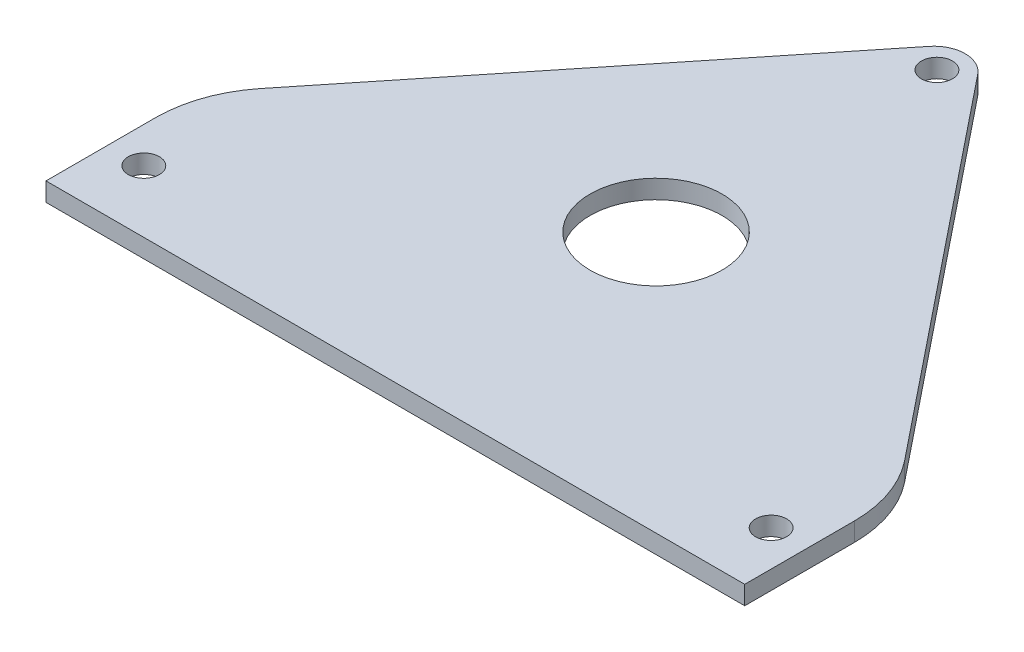
ISO-10303-21;
HEADER;
FILE_DESCRIPTION(('STEP AP214'),'2;1');
FILE_NAME('part.step','',(''),(''),'','','');
FILE_SCHEMA(('AUTOMOTIVE_DESIGN { 1 0 10303 214 1 1 1 1 }'));
ENDSEC;
DATA;
#1=APPLICATION_CONTEXT('core data for automotive mechanical design processes');
#2=APPLICATION_PROTOCOL_DEFINITION('international standard','automotive_design',2000,#1);
#3=PRODUCT_CONTEXT('',#1,'mechanical');
#4=PRODUCT('Part','Part','',(#3));
#5=PRODUCT_RELATED_PRODUCT_CATEGORY('part','',(#4));
#6=PRODUCT_DEFINITION_FORMATION('','',#4);
#7=PRODUCT_DEFINITION_CONTEXT('part definition',#1,'design');
#8=PRODUCT_DEFINITION('design','',#6,#7);
#9=PRODUCT_DEFINITION_SHAPE('','',#8);
#10=(LENGTH_UNIT() NAMED_UNIT(*) SI_UNIT(.MILLI.,.METRE.));
#11=(NAMED_UNIT(*) PLANE_ANGLE_UNIT() SI_UNIT($,.RADIAN.));
#12=(NAMED_UNIT(*) SI_UNIT($,.STERADIAN.) SOLID_ANGLE_UNIT());
#13=UNCERTAINTY_MEASURE_WITH_UNIT(LENGTH_MEASURE(1.E-05),#10,'distance_accuracy_value','');
#14=(GEOMETRIC_REPRESENTATION_CONTEXT(3) GLOBAL_UNCERTAINTY_ASSIGNED_CONTEXT((#13)) GLOBAL_UNIT_ASSIGNED_CONTEXT((#10,
#11,#12)) REPRESENTATION_CONTEXT('',''));
#15=CARTESIAN_POINT('',(0.,0.,0.));
#16=DIRECTION('',(0.,0.,1.));
#17=DIRECTION('',(1.,0.,0.));
#18=AXIS2_PLACEMENT_3D('',#15,#16,#17);
#19=CARTESIAN_POINT('',(0.,1.2,0.));
#20=DIRECTION('',(0.,-1.,0.));
#21=DIRECTION('',(0.,0.,-1.));
#22=AXIS2_PLACEMENT_3D('',#19,#20,#21);
#23=PLANE('',#22);
#24=CARTESIAN_POINT('',(22.5,1.2,-35.14));
#25=DIRECTION('',(0.,1.,0.));
#26=DIRECTION('',(0.,0.,1.));
#27=AXIS2_PLACEMENT_3D('',#24,#25,#26);
#28=CIRCLE('',#27,1.);
#29=CARTESIAN_POINT('',(22.5,1.2,-34.14));
#30=VERTEX_POINT('',#29);
#31=EDGE_CURVE('E204',#30,#30,#28,.T.);
#32=ORIENTED_EDGE('',*,*,#31,.F.);
#33=EDGE_LOOP('',(#32));
#34=FACE_BOUND('',#33,.T.);
#35=CARTESIAN_POINT('',(22.5,1.2,-17.05));
#36=DIRECTION('',(0.,1.,0.));
#37=DIRECTION('',(0.,0.,1.));
#38=AXIS2_PLACEMENT_3D('',#35,#36,#37);
#39=CIRCLE('',#38,4.25);
#40=CARTESIAN_POINT('',(22.5,1.2,-12.8));
#41=VERTEX_POINT('',#40);
#42=EDGE_CURVE('E202',#41,#41,#39,.T.);
#43=ORIENTED_EDGE('',*,*,#42,.F.);
#44=EDGE_LOOP('',(#43));
#45=FACE_BOUND('',#44,.T.);
#46=CARTESIAN_POINT('',(2.3,1.2,-4.26));
#47=DIRECTION('',(0.,1.,0.));
#48=DIRECTION('',(0.,0.,1.));
#49=AXIS2_PLACEMENT_3D('',#46,#47,#48);
#50=CIRCLE('',#49,1.);
#51=CARTESIAN_POINT('',(2.3,1.2,-3.26));
#52=VERTEX_POINT('',#51);
#53=EDGE_CURVE('E187',#52,#52,#50,.T.);
#54=ORIENTED_EDGE('',*,*,#53,.F.);
#55=EDGE_LOOP('',(#54));
#56=FACE_BOUND('',#55,.T.);
#57=CARTESIAN_POINT('',(42.7,1.2,-4.26));
#58=DIRECTION('',(0.,1.,0.));
#59=DIRECTION('',(0.,0.,-1.));
#60=AXIS2_PLACEMENT_3D('',#57,#58,#59);
#61=CIRCLE('',#60,1.);
#62=CARTESIAN_POINT('',(42.7,1.2,-5.26));
#63=VERTEX_POINT('',#62);
#64=EDGE_CURVE('E195',#63,#63,#61,.T.);
#65=ORIENTED_EDGE('',*,*,#64,.F.);
#66=EDGE_LOOP('',(#65));
#67=FACE_BOUND('',#66,.T.);
#68=DIRECTION('',(-1.,0.,0.));
#69=VECTOR('',#68,1.);
#70=CARTESIAN_POINT('',(0.,1.2,-0.26));
#71=LINE('',#70,#69);
#72=CARTESIAN_POINT('',(45.,1.2,-0.26));
#73=VERTEX_POINT('',#72);
#74=CARTESIAN_POINT('',(0.,1.2,-0.26));
#75=VERTEX_POINT('',#74);
#76=EDGE_CURVE('E102',#73,#75,#71,.T.);
#77=ORIENTED_EDGE('',*,*,#76,.F.);
#78=DIRECTION('',(0.,0.,-1.));
#79=VECTOR('',#78,1.);
#80=CARTESIAN_POINT('',(45.,1.2,0.));
#81=LINE('',#80,#79);
#82=CARTESIAN_POINT('',(45.,1.2,-7.31581784542609));
#83=VERTEX_POINT('',#82);
#84=EDGE_CURVE('E132',#73,#83,#81,.T.);
#85=ORIENTED_EDGE('',*,*,#84,.T.);
#86=CARTESIAN_POINT('',(37.,1.2,-7.31581784542609));
#87=DIRECTION('',(0.,-1.,0.));
#88=DIRECTION('',(0.,0.,-1.));
#89=AXIS2_PLACEMENT_3D('',#86,#87,#88);
#90=CIRCLE('',#89,8.);
#91=CARTESIAN_POINT('',(43.2377926461262,1.2,-12.3248040606132));
#92=VERTEX_POINT('',#91);
#93=EDGE_CURVE('E136',#83,#92,#90,.F.);
#94=ORIENTED_EDGE('',*,*,#93,.T.);
#95=DIRECTION('',(0.626123276898389,0.,0.779724080765768));
#96=VECTOR('',#95,1.);
#97=CARTESIAN_POINT('',(22.5,1.2,-38.15));
#98=LINE('',#97,#96);
#99=CARTESIAN_POINT('',(24.0594481615315,1.2,-36.2079874137959));
#100=VERTEX_POINT('',#99);
#101=EDGE_CURVE('E126',#100,#92,#98,.T.);
#102=ORIENTED_EDGE('',*,*,#101,.F.);
#103=CARTESIAN_POINT('',(22.5,1.2,-34.9557408599991));
#104=DIRECTION('',(0.,-1.,0.));
#105=DIRECTION('',(0.,0.,-1.));
#106=AXIS2_PLACEMENT_3D('',#103,#104,#105);
#107=CIRCLE('',#106,2.);
#108=CARTESIAN_POINT('',(20.9405518384685,1.2,-36.2079874137959));
#109=VERTEX_POINT('',#108);
#110=EDGE_CURVE('E160',#100,#109,#107,.F.);
#111=ORIENTED_EDGE('',*,*,#110,.T.);
#112=DIRECTION('',(0.626123276898389,0.,-0.779724080765768));
#113=VECTOR('',#112,1.);
#114=CARTESIAN_POINT('',(0.,1.2,-10.1302913187703));
#115=LINE('',#114,#113);
#116=CARTESIAN_POINT('',(1.76220735387385,1.2,-12.3248040606132));
#117=VERTEX_POINT('',#116);
#118=EDGE_CURVE('E163',#117,#109,#115,.T.);
#119=ORIENTED_EDGE('',*,*,#118,.F.);
#120=CARTESIAN_POINT('',(8.,1.2,-7.3158178454261));
#121=DIRECTION('',(0.,-1.,0.));
#122=DIRECTION('',(0.,0.,-1.));
#123=AXIS2_PLACEMENT_3D('',#120,#121,#122);
#124=CIRCLE('',#123,8.);
#125=CARTESIAN_POINT('',(0.,1.2,-7.3158178454261));
#126=VERTEX_POINT('',#125);
#127=EDGE_CURVE('E138',#117,#126,#124,.F.);
#128=ORIENTED_EDGE('',*,*,#127,.T.);
#129=DIRECTION('',(0.,0.,1.));
#130=VECTOR('',#129,1.);
#131=CARTESIAN_POINT('',(0.,1.2,0.));
#132=LINE('',#131,#130);
#133=EDGE_CURVE('E130',#126,#75,#132,.T.);
#134=ORIENTED_EDGE('',*,*,#133,.T.);
#135=EDGE_LOOP('',(#77,#85,#94,#102,#111,#119,#128,#134));
#136=FACE_BOUND('',#135,.T.);
#137=ADVANCED_FACE('F39',(#34,#45,#56,#67,#136),#23,.F.);
#138=CARTESIAN_POINT('',(0.,0.,0.));
#139=DIRECTION('',(0.,-1.,0.));
#140=DIRECTION('',(0.,0.,-1.));
#141=AXIS2_PLACEMENT_3D('',#138,#139,#140);
#142=PLANE('',#141);
#143=CARTESIAN_POINT('',(22.5,0.,-35.14));
#144=DIRECTION('',(0.,1.,0.));
#145=DIRECTION('',(0.,0.,1.));
#146=AXIS2_PLACEMENT_3D('',#143,#144,#145);
#147=CIRCLE('',#146,1.);
#148=CARTESIAN_POINT('',(22.5,0.,-34.14));
#149=VERTEX_POINT('',#148);
#150=EDGE_CURVE('E194',#149,#149,#147,.T.);
#151=ORIENTED_EDGE('',*,*,#150,.T.);
#152=EDGE_LOOP('',(#151));
#153=FACE_BOUND('',#152,.T.);
#154=CARTESIAN_POINT('',(22.5,0.,-17.05));
#155=DIRECTION('',(0.,1.,0.));
#156=DIRECTION('',(0.,0.,1.));
#157=AXIS2_PLACEMENT_3D('',#154,#155,#156);
#158=CIRCLE('',#157,4.25);
#159=CARTESIAN_POINT('',(22.5,0.,-12.8));
#160=VERTEX_POINT('',#159);
#161=EDGE_CURVE('E199',#160,#160,#158,.T.);
#162=ORIENTED_EDGE('',*,*,#161,.T.);
#163=EDGE_LOOP('',(#162));
#164=FACE_BOUND('',#163,.T.);
#165=CARTESIAN_POINT('',(2.3,0.,-4.26));
#166=DIRECTION('',(0.,1.,0.));
#167=DIRECTION('',(0.,0.,1.));
#168=AXIS2_PLACEMENT_3D('',#165,#166,#167);
#169=CIRCLE('',#168,1.);
#170=CARTESIAN_POINT('',(2.3,0.,-3.26));
#171=VERTEX_POINT('',#170);
#172=EDGE_CURVE('E183',#171,#171,#169,.T.);
#173=ORIENTED_EDGE('',*,*,#172,.T.);
#174=EDGE_LOOP('',(#173));
#175=FACE_BOUND('',#174,.T.);
#176=CARTESIAN_POINT('',(42.7,0.,-4.26));
#177=DIRECTION('',(0.,1.,0.));
#178=DIRECTION('',(0.,0.,-1.));
#179=AXIS2_PLACEMENT_3D('',#176,#177,#178);
#180=CIRCLE('',#179,1.);
#181=CARTESIAN_POINT('',(42.7,0.,-5.26));
#182=VERTEX_POINT('',#181);
#183=EDGE_CURVE('E186',#182,#182,#180,.T.);
#184=ORIENTED_EDGE('',*,*,#183,.T.);
#185=EDGE_LOOP('',(#184));
#186=FACE_BOUND('',#185,.T.);
#187=DIRECTION('',(0.,0.,-1.));
#188=VECTOR('',#187,1.);
#189=CARTESIAN_POINT('',(45.,0.,0.));
#190=LINE('',#189,#188);
#191=CARTESIAN_POINT('',(45.,0.,-0.26));
#192=VERTEX_POINT('',#191);
#193=CARTESIAN_POINT('',(45.,0.,-7.31581784542609));
#194=VERTEX_POINT('',#193);
#195=EDGE_CURVE('E119',#192,#194,#190,.T.);
#196=ORIENTED_EDGE('',*,*,#195,.F.);
#197=DIRECTION('',(-1.,0.,0.));
#198=VECTOR('',#197,1.);
#199=CARTESIAN_POINT('',(0.,0.,-0.26));
#200=LINE('',#199,#198);
#201=CARTESIAN_POINT('',(0.,0.,-0.26));
#202=VERTEX_POINT('',#201);
#203=EDGE_CURVE('E53',#192,#202,#200,.T.);
#204=ORIENTED_EDGE('',*,*,#203,.T.);
#205=DIRECTION('',(0.,0.,1.));
#206=VECTOR('',#205,1.);
#207=CARTESIAN_POINT('',(0.,0.,0.));
#208=LINE('',#207,#206);
#209=CARTESIAN_POINT('',(0.,0.,-7.3158178454261));
#210=VERTEX_POINT('',#209);
#211=EDGE_CURVE('E120',#210,#202,#208,.T.);
#212=ORIENTED_EDGE('',*,*,#211,.F.);
#213=CARTESIAN_POINT('',(8.,0.,-7.3158178454261));
#214=DIRECTION('',(0.,-1.,0.));
#215=DIRECTION('',(0.,0.,-1.));
#216=AXIS2_PLACEMENT_3D('',#213,#214,#215);
#217=CIRCLE('',#216,8.);
#218=CARTESIAN_POINT('',(1.76220735387385,0.,-12.3248040606132));
#219=VERTEX_POINT('',#218);
#220=EDGE_CURVE('E147',#210,#219,#217,.T.);
#221=ORIENTED_EDGE('',*,*,#220,.T.);
#222=DIRECTION('',(0.626123276898389,0.,-0.779724080765768));
#223=VECTOR('',#222,1.);
#224=CARTESIAN_POINT('',(0.,0.,-10.1302913187703));
#225=LINE('',#224,#223);
#226=CARTESIAN_POINT('',(20.9405518384685,0.,-36.2079874137959));
#227=VERTEX_POINT('',#226);
#228=EDGE_CURVE('E109',#219,#227,#225,.T.);
#229=ORIENTED_EDGE('',*,*,#228,.T.);
#230=CARTESIAN_POINT('',(22.5,0.,-34.9557408599991));
#231=DIRECTION('',(0.,-1.,0.));
#232=DIRECTION('',(0.,0.,-1.));
#233=AXIS2_PLACEMENT_3D('',#230,#231,#232);
#234=CIRCLE('',#233,2.);
#235=CARTESIAN_POINT('',(24.0594481615315,0.,-36.2079874137959));
#236=VERTEX_POINT('',#235);
#237=EDGE_CURVE('E11',#227,#236,#234,.T.);
#238=ORIENTED_EDGE('',*,*,#237,.T.);
#239=DIRECTION('',(0.626123276898389,0.,0.779724080765768));
#240=VECTOR('',#239,1.);
#241=CARTESIAN_POINT('',(22.5,0.,-38.15));
#242=LINE('',#241,#240);
#243=CARTESIAN_POINT('',(43.2377926461262,0.,-12.3248040606132));
#244=VERTEX_POINT('',#243);
#245=EDGE_CURVE('E123',#236,#244,#242,.T.);
#246=ORIENTED_EDGE('',*,*,#245,.T.);
#247=CARTESIAN_POINT('',(37.,0.,-7.31581784542609));
#248=DIRECTION('',(0.,-1.,0.));
#249=DIRECTION('',(0.,0.,-1.));
#250=AXIS2_PLACEMENT_3D('',#247,#248,#249);
#251=CIRCLE('',#250,8.);
#252=EDGE_CURVE('E149',#244,#194,#251,.T.);
#253=ORIENTED_EDGE('',*,*,#252,.T.);
#254=EDGE_LOOP('',(#196,#204,#212,#221,#229,#238,#246,#253));
#255=FACE_BOUND('',#254,.T.);
#256=ADVANCED_FACE('F116',(#153,#164,#175,#186,#255),#142,.T.);
#257=CARTESIAN_POINT('',(45.,1.2,0.));
#258=DIRECTION('',(-1.,0.,0.));
#259=DIRECTION('',(0.,0.,1.));
#260=AXIS2_PLACEMENT_3D('',#257,#258,#259);
#261=PLANE('',#260);
#262=DIRECTION('',(0.,1.,0.));
#263=VECTOR('',#262,1.);
#264=CARTESIAN_POINT('',(45.,0.,-0.26));
#265=LINE('',#264,#263);
#266=EDGE_CURVE('E111',#192,#73,#265,.T.);
#267=ORIENTED_EDGE('',*,*,#266,.F.);
#268=ORIENTED_EDGE('',*,*,#195,.T.);
#269=DIRECTION('',(0.,1.,0.));
#270=VECTOR('',#269,1.);
#271=CARTESIAN_POINT('',(45.,1.2,-7.31581784542609));
#272=LINE('',#271,#270);
#273=EDGE_CURVE('E135',#194,#83,#272,.T.);
#274=ORIENTED_EDGE('',*,*,#273,.T.);
#275=ORIENTED_EDGE('',*,*,#84,.F.);
#276=EDGE_LOOP('',(#267,#268,#274,#275));
#277=FACE_BOUND('',#276,.T.);
#278=ADVANCED_FACE('F177',(#277),#261,.F.);
#279=CARTESIAN_POINT('',(0.,1.2,0.));
#280=DIRECTION('',(1.,0.,0.));
#281=DIRECTION('',(0.,0.,-1.));
#282=AXIS2_PLACEMENT_3D('',#279,#280,#281);
#283=PLANE('',#282);
#284=ORIENTED_EDGE('',*,*,#211,.T.);
#285=DIRECTION('',(0.,1.,0.));
#286=VECTOR('',#285,1.);
#287=CARTESIAN_POINT('',(0.,0.,-0.26));
#288=LINE('',#287,#286);
#289=EDGE_CURVE('E105',#202,#75,#288,.T.);
#290=ORIENTED_EDGE('',*,*,#289,.T.);
#291=ORIENTED_EDGE('',*,*,#133,.F.);
#292=DIRECTION('',(0.,1.,0.));
#293=VECTOR('',#292,1.);
#294=CARTESIAN_POINT('',(0.,1.2,-7.3158178454261));
#295=LINE('',#294,#293);
#296=EDGE_CURVE('E121',#126,#210,#295,.F.);
#297=ORIENTED_EDGE('',*,*,#296,.T.);
#298=EDGE_LOOP('',(#284,#290,#291,#297));
#299=FACE_BOUND('',#298,.T.);
#300=ADVANCED_FACE('F125',(#299),#283,.F.);
#301=CARTESIAN_POINT('',(22.5,0.,-38.15));
#302=DIRECTION('',(-0.779724080765769,0.,0.626123276898389));
#303=DIRECTION('',(0.626123276898389,0.,0.779724080765769));
#304=AXIS2_PLACEMENT_3D('',#301,#302,#303);
#305=PLANE('',#304);
#306=ORIENTED_EDGE('',*,*,#245,.F.);
#307=DIRECTION('',(0.,1.,0.));
#308=VECTOR('',#307,1.);
#309=CARTESIAN_POINT('',(24.0594481615315,0.,-36.2079874137959));
#310=LINE('',#309,#308);
#311=EDGE_CURVE('E153',#236,#100,#310,.T.);
#312=ORIENTED_EDGE('',*,*,#311,.T.);
#313=ORIENTED_EDGE('',*,*,#101,.T.);
#314=DIRECTION('',(0.,1.,0.));
#315=VECTOR('',#314,1.);
#316=CARTESIAN_POINT('',(43.2377926461262,0.,-12.3248040606132));
#317=LINE('',#316,#315);
#318=EDGE_CURVE('E141',#92,#244,#317,.F.);
#319=ORIENTED_EDGE('',*,*,#318,.T.);
#320=EDGE_LOOP('',(#306,#312,#313,#319));
#321=FACE_BOUND('',#320,.T.);
#322=ADVANCED_FACE('F167',(#321),#305,.F.);
#323=CARTESIAN_POINT('',(0.,0.,-10.1302913187703));
#324=DIRECTION('',(0.779724080765769,0.,0.626123276898389));
#325=DIRECTION('',(0.626123276898389,0.,-0.779724080765769));
#326=AXIS2_PLACEMENT_3D('',#323,#324,#325);
#327=PLANE('',#326);
#328=ORIENTED_EDGE('',*,*,#118,.T.);
#329=DIRECTION('',(0.,1.,0.));
#330=VECTOR('',#329,1.);
#331=CARTESIAN_POINT('',(20.9405518384685,0.,-36.2079874137959));
#332=LINE('',#331,#330);
#333=EDGE_CURVE('E50',#109,#227,#332,.F.);
#334=ORIENTED_EDGE('',*,*,#333,.T.);
#335=ORIENTED_EDGE('',*,*,#228,.F.);
#336=DIRECTION('',(0.,1.,0.));
#337=VECTOR('',#336,1.);
#338=CARTESIAN_POINT('',(1.76220735387385,0.,-12.3248040606132));
#339=LINE('',#338,#337);
#340=EDGE_CURVE('E148',#219,#117,#339,.T.);
#341=ORIENTED_EDGE('',*,*,#340,.T.);
#342=EDGE_LOOP('',(#328,#334,#335,#341));
#343=FACE_BOUND('',#342,.T.);
#344=ADVANCED_FACE('F165',(#343),#327,.F.);
#345=CARTESIAN_POINT('',(37.,1.2,-7.31581784542609));
#346=DIRECTION('',(0.,1.,0.));
#347=DIRECTION('',(0.,0.,1.));
#348=AXIS2_PLACEMENT_3D('',#345,#346,#347);
#349=CYLINDRICAL_SURFACE('',#348,8.);
#350=ORIENTED_EDGE('',*,*,#252,.F.);
#351=ORIENTED_EDGE('',*,*,#318,.F.);
#352=ORIENTED_EDGE('',*,*,#93,.F.);
#353=ORIENTED_EDGE('',*,*,#273,.F.);
#354=EDGE_LOOP('',(#350,#351,#352,#353));
#355=FACE_BOUND('',#354,.T.);
#356=ADVANCED_FACE('F176',(#355),#349,.T.);
#357=CARTESIAN_POINT('',(8.,0.,-7.3158178454261));
#358=DIRECTION('',(0.,1.,0.));
#359=DIRECTION('',(0.,0.,1.));
#360=AXIS2_PLACEMENT_3D('',#357,#358,#359);
#361=CYLINDRICAL_SURFACE('',#360,8.);
#362=ORIENTED_EDGE('',*,*,#220,.F.);
#363=ORIENTED_EDGE('',*,*,#296,.F.);
#364=ORIENTED_EDGE('',*,*,#127,.F.);
#365=ORIENTED_EDGE('',*,*,#340,.F.);
#366=EDGE_LOOP('',(#362,#363,#364,#365));
#367=FACE_BOUND('',#366,.T.);
#368=ADVANCED_FACE('F251',(#367),#361,.T.);
#369=CARTESIAN_POINT('',(22.5,0.,-34.9557408599991));
#370=DIRECTION('',(0.,1.,0.));
#371=DIRECTION('',(0.,0.,1.));
#372=AXIS2_PLACEMENT_3D('',#369,#370,#371);
#373=CYLINDRICAL_SURFACE('',#372,2.);
#374=ORIENTED_EDGE('',*,*,#237,.F.);
#375=ORIENTED_EDGE('',*,*,#333,.F.);
#376=ORIENTED_EDGE('',*,*,#110,.F.);
#377=ORIENTED_EDGE('',*,*,#311,.F.);
#378=EDGE_LOOP('',(#374,#375,#376,#377));
#379=FACE_BOUND('',#378,.T.);
#380=ADVANCED_FACE('F41',(#379),#373,.T.);
#381=CARTESIAN_POINT('',(0.,0.,-0.26));
#382=DIRECTION('',(0.,0.,-1.));
#383=DIRECTION('',(-1.,0.,0.));
#384=AXIS2_PLACEMENT_3D('',#381,#382,#383);
#385=PLANE('',#384);
#386=ORIENTED_EDGE('',*,*,#76,.T.);
#387=ORIENTED_EDGE('',*,*,#289,.F.);
#388=ORIENTED_EDGE('',*,*,#203,.F.);
#389=ORIENTED_EDGE('',*,*,#266,.T.);
#390=EDGE_LOOP('',(#386,#387,#388,#389));
#391=FACE_BOUND('',#390,.T.);
#392=ADVANCED_FACE('F101',(#391),#385,.F.);
#393=CARTESIAN_POINT('',(42.7,0.,-4.26));
#394=DIRECTION('',(0.,1.,0.));
#395=DIRECTION('',(0.,0.,1.));
#396=AXIS2_PLACEMENT_3D('',#393,#394,#395);
#397=CYLINDRICAL_SURFACE('',#396,1.);
#398=ORIENTED_EDGE('',*,*,#183,.F.);
#399=EDGE_LOOP('',(#398));
#400=FACE_BOUND('',#399,.T.);
#401=ORIENTED_EDGE('',*,*,#64,.T.);
#402=EDGE_LOOP('',(#401));
#403=FACE_BOUND('',#402,.T.);
#404=ADVANCED_FACE('F226',(#400,#403),#397,.F.);
#405=CARTESIAN_POINT('',(2.3,0.,-4.26));
#406=DIRECTION('',(0.,1.,0.));
#407=DIRECTION('',(0.,0.,1.));
#408=AXIS2_PLACEMENT_3D('',#405,#406,#407);
#409=CYLINDRICAL_SURFACE('',#408,1.);
#410=ORIENTED_EDGE('',*,*,#172,.F.);
#411=EDGE_LOOP('',(#410));
#412=FACE_BOUND('',#411,.T.);
#413=ORIENTED_EDGE('',*,*,#53,.T.);
#414=EDGE_LOOP('',(#413));
#415=FACE_BOUND('',#414,.T.);
#416=ADVANCED_FACE('F229',(#412,#415),#409,.F.);
#417=CARTESIAN_POINT('',(22.5,0.,-17.05));
#418=DIRECTION('',(0.,1.,0.));
#419=DIRECTION('',(0.,0.,1.));
#420=AXIS2_PLACEMENT_3D('',#417,#418,#419);
#421=CYLINDRICAL_SURFACE('',#420,4.25);
#422=ORIENTED_EDGE('',*,*,#161,.F.);
#423=EDGE_LOOP('',(#422));
#424=FACE_BOUND('',#423,.T.);
#425=ORIENTED_EDGE('',*,*,#42,.T.);
#426=EDGE_LOOP('',(#425));
#427=FACE_BOUND('',#426,.T.);
#428=ADVANCED_FACE('F213',(#424,#427),#421,.F.);
#429=CARTESIAN_POINT('',(22.5,0.,-35.14));
#430=DIRECTION('',(0.,1.,0.));
#431=DIRECTION('',(0.,0.,1.));
#432=AXIS2_PLACEMENT_3D('',#429,#430,#431);
#433=CYLINDRICAL_SURFACE('',#432,1.);
#434=ORIENTED_EDGE('',*,*,#150,.F.);
#435=EDGE_LOOP('',(#434));
#436=FACE_BOUND('',#435,.T.);
#437=ORIENTED_EDGE('',*,*,#31,.T.);
#438=EDGE_LOOP('',(#437));
#439=FACE_BOUND('',#438,.T.);
#440=ADVANCED_FACE('F215',(#436,#439),#433,.F.);
#441=CLOSED_SHELL('',(#137,#256,#278,#300,#322,#344,#356,#368,#380,#392,#404,#416,#428,#440));
#442=MANIFOLD_SOLID_BREP('B2',#441);
#443=ADVANCED_BREP_SHAPE_REPRESENTATION('',(#18,#442),#14);
#444=SHAPE_DEFINITION_REPRESENTATION(#9,#443);
ENDSEC;
END-ISO-10303-21;
